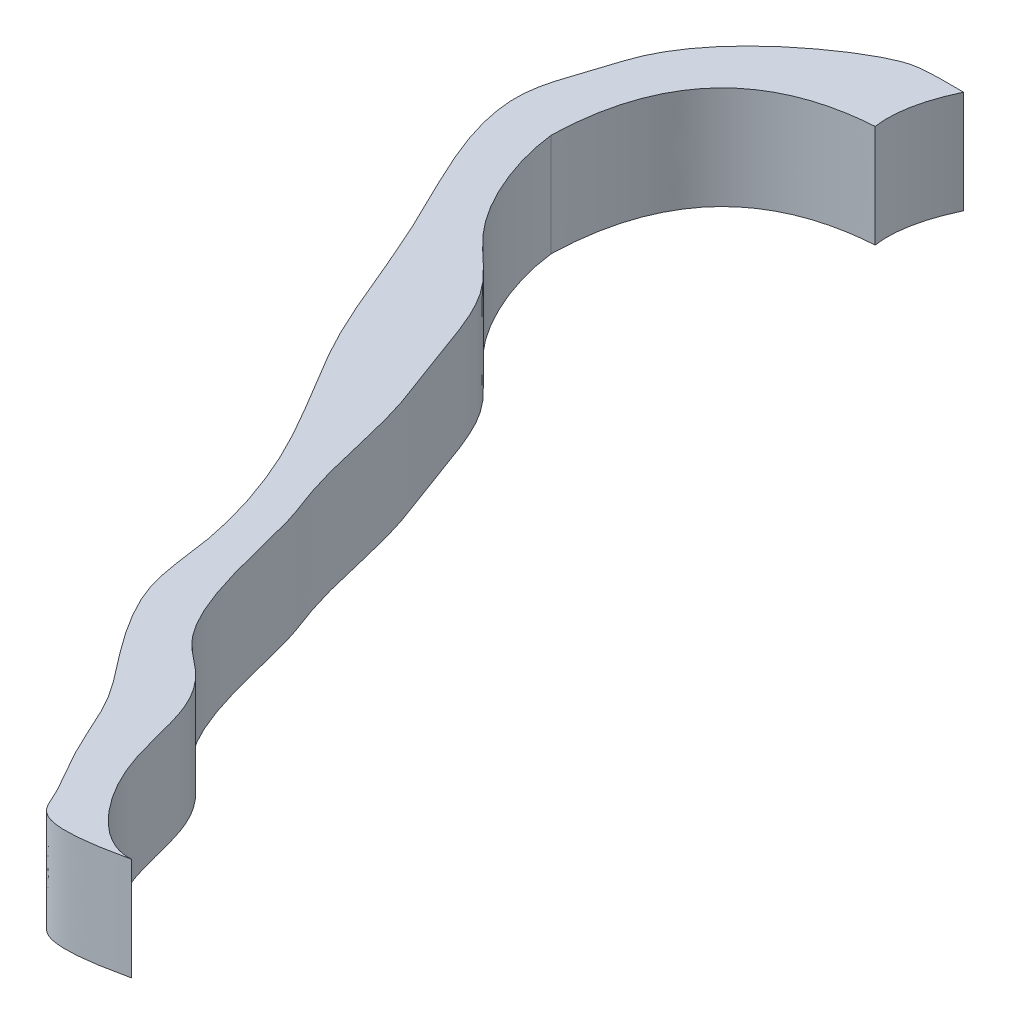
ISO-10303-21;
HEADER;
FILE_DESCRIPTION(('STEP AP214'),'2;1');
FILE_NAME('part.step','',(''),(''),'','','');
FILE_SCHEMA(('AUTOMOTIVE_DESIGN { 1 0 10303 214 1 1 1 1 }'));
ENDSEC;
DATA;
#1=APPLICATION_CONTEXT('core data for automotive mechanical design processes');
#2=APPLICATION_PROTOCOL_DEFINITION('international standard','automotive_design',2000,#1);
#3=PRODUCT_CONTEXT('',#1,'mechanical');
#4=PRODUCT('Part','Part','',(#3));
#5=PRODUCT_RELATED_PRODUCT_CATEGORY('part','',(#4));
#6=PRODUCT_DEFINITION_FORMATION('','',#4);
#7=PRODUCT_DEFINITION_CONTEXT('part definition',#1,'design');
#8=PRODUCT_DEFINITION('design','',#6,#7);
#9=PRODUCT_DEFINITION_SHAPE('','',#8);
#10=(LENGTH_UNIT() NAMED_UNIT(*) SI_UNIT(.MILLI.,.METRE.));
#11=(NAMED_UNIT(*) PLANE_ANGLE_UNIT() SI_UNIT($,.RADIAN.));
#12=(NAMED_UNIT(*) SI_UNIT($,.STERADIAN.) SOLID_ANGLE_UNIT());
#13=UNCERTAINTY_MEASURE_WITH_UNIT(LENGTH_MEASURE(1.E-05),#10,'distance_accuracy_value','');
#14=(GEOMETRIC_REPRESENTATION_CONTEXT(3) GLOBAL_UNCERTAINTY_ASSIGNED_CONTEXT((#13)) GLOBAL_UNIT_ASSIGNED_CONTEXT((#10,
#11,#12)) REPRESENTATION_CONTEXT('',''));
#15=CARTESIAN_POINT('',(0.,0.,0.));
#16=DIRECTION('',(0.,0.,1.));
#17=DIRECTION('',(1.,0.,0.));
#18=AXIS2_PLACEMENT_3D('',#15,#16,#17);
#19=CARTESIAN_POINT('',(24.0375140392618,15.,-145.517039337161));
#20=CARTESIAN_POINT('',(24.2621933412284,15.,-143.639002282934));
#21=CARTESIAN_POINT('',(25.4171269550409,15.,-138.134761259731));
#22=CARTESIAN_POINT('',(30.007706348826,15.,-128.35761833204));
#23=CARTESIAN_POINT('',(39.7991492205917,15.,-121.115164183697));
#24=CARTESIAN_POINT('',(43.2128797081711,15.,-110.146291015422));
#25=CARTESIAN_POINT('',(48.6550116352046,15.,-97.0573730260903));
#26=CARTESIAN_POINT('',(49.9672872180633,15.,-86.7279437435889));
#27=CARTESIAN_POINT('',(54.645986214799,15.,-75.4111400507352));
#28=CARTESIAN_POINT('',(57.5935042038401,15.,-57.5488206758712));
#29=CARTESIAN_POINT('',(72.3520359826397,15.,-47.8515999679621));
#30=CARTESIAN_POINT('',(69.1403617110827,15.,-35.8249751369739));
#31=CARTESIAN_POINT('',(82.723997719919,15.,-21.3135393408815));
#32=CARTESIAN_POINT('',(91.4610009765337,15.,-26.0845568898553));
#33=CARTESIAN_POINT('',(99.3599729309819,15.,-34.1459829190389));
#34=CARTESIAN_POINT('',(106.459091673804,15.,-48.0552498706429));
#35=CARTESIAN_POINT('',(101.533602131844,15.,-62.2604950775486));
#36=CARTESIAN_POINT('',(98.8404018994915,15.,-74.4775870626433));
#37=CARTESIAN_POINT('',(96.868182285158,15.,-87.5543523438553));
#38=CARTESIAN_POINT('',(101.802241124934,15.,-102.14324591199));
#39=CARTESIAN_POINT('',(102.790355638582,15.,-119.297508142269));
#40=CARTESIAN_POINT('',(104.336005258598,15.,-130.446896525846));
#41=CARTESIAN_POINT('',(105.753591562007,15.,-137.401839946369));
#42=CARTESIAN_POINT('',(105.757273732984,15.,-137.419894275042));
#43=B_SPLINE_CURVE_WITH_KNOTS('',3,(#19,#20,#21,#22,#23,#24,#25,#26,#27,#28,#29,#30,#31,#32,#33,
#34,#35,#36,#37,#38,#39,#40,#41,#42),.UNSPECIFIED.,.F.,.F.,(4,1,1,1,1,1,1,1,1,1,1,1,1,1,1,1,1,1,
1,1,1,4),(0.0848827910846383,0.107769947600504,0.154078141193935,0.187829052452645,
0.232552432956342,0.26970929217058,0.335228905495779,0.34759696703288,0.388301803040621,
0.400297277197863,0.462463604104336,0.490432200988639,0.503110695907215,0.523547211958244,
0.568461378057781,0.596541231678332,0.621395322375599,0.653634391335673,0.683152646319912,
0.723780599049945,0.766209008009937,0.766319387221955),.UNSPECIFIED.);
#44=DIRECTION('',(0.,-1.,0.));
#45=VECTOR('',#44,1.);
#46=SURFACE_OF_LINEAR_EXTRUSION('',#43,#45);
#47=CARTESIAN_POINT('',(24.0375140392618,0.,-145.517039337161));
#48=CARTESIAN_POINT('',(24.2621933412284,0.,-143.639002282934));
#49=CARTESIAN_POINT('',(25.4171269550409,0.,-138.134761259731));
#50=CARTESIAN_POINT('',(30.007706348826,0.,-128.35761833204));
#51=CARTESIAN_POINT('',(39.7991492205917,0.,-121.115164183697));
#52=CARTESIAN_POINT('',(43.2128797081711,0.,-110.146291015422));
#53=CARTESIAN_POINT('',(48.6550116352046,0.,-97.0573730260903));
#54=CARTESIAN_POINT('',(49.9672872180633,0.,-86.7279437435889));
#55=CARTESIAN_POINT('',(54.645986214799,0.,-75.4111400507352));
#56=CARTESIAN_POINT('',(57.5935042038401,0.,-57.5488206758712));
#57=CARTESIAN_POINT('',(72.3520359826397,0.,-47.8515999679621));
#58=CARTESIAN_POINT('',(69.1403617110827,0.,-35.8249751369739));
#59=CARTESIAN_POINT('',(82.723997719919,0.,-21.3135393408815));
#60=CARTESIAN_POINT('',(91.4610009765337,0.,-26.0845568898553));
#61=CARTESIAN_POINT('',(99.3599729309819,0.,-34.1459829190389));
#62=CARTESIAN_POINT('',(106.459091673804,0.,-48.0552498706429));
#63=CARTESIAN_POINT('',(101.533602131844,0.,-62.2604950775486));
#64=CARTESIAN_POINT('',(98.8404018994915,0.,-74.4775870626433));
#65=CARTESIAN_POINT('',(96.868182285158,0.,-87.5543523438553));
#66=CARTESIAN_POINT('',(101.802241124934,0.,-102.14324591199));
#67=CARTESIAN_POINT('',(102.790355638582,0.,-119.297508142269));
#68=CARTESIAN_POINT('',(104.336005258598,0.,-130.446896525846));
#69=CARTESIAN_POINT('',(105.753591562007,0.,-137.401839946369));
#70=CARTESIAN_POINT('',(105.757273732984,0.,-137.419894275042));
#71=B_SPLINE_CURVE_WITH_KNOTS('',3,(#47,#48,#49,#50,#51,#52,#53,#54,#55,#56,#57,#58,#59,#60,#61,
#62,#63,#64,#65,#66,#67,#68,#69,#70),.UNSPECIFIED.,.F.,.F.,(4,1,1,1,1,1,1,1,1,1,1,1,1,1,1,1,1,1,
1,1,1,4),(0.0848827910846383,0.107769947600504,0.154078141193935,0.187829052452645,
0.232552432956342,0.26970929217058,0.335228905495779,0.34759696703288,0.388301803040621,
0.400297277197863,0.462463604104336,0.490432200988639,0.503110695907215,0.523547211958244,
0.568461378057781,0.596541231678332,0.621395322375599,0.653634391335673,0.683152646319912,
0.723780599049945,0.766209008009937,0.766319387221955),.UNSPECIFIED.);
#72=CARTESIAN_POINT('',(24.0375140392618,0.,-145.517039337161));
#73=VERTEX_POINT('',#72);
#74=CARTESIAN_POINT('',(84.954156508845,0.,-23.3748451477507));
#75=VERTEX_POINT('',#74);
#76=EDGE_CURVE('E120',#73,#75,#71,.T.);
#77=ORIENTED_EDGE('',*,*,#76,.F.);
#78=DIRECTION('',(0.,-1.,0.));
#79=VECTOR('',#78,1.);
#80=CARTESIAN_POINT('',(24.0375140392618,15.,-145.517039337161));
#81=LINE('',#80,#79);
#82=CARTESIAN_POINT('',(24.0375140392618,15.,-145.517039337161));
#83=VERTEX_POINT('',#82);
#84=EDGE_CURVE('E11',#83,#73,#81,.T.);
#85=ORIENTED_EDGE('',*,*,#84,.F.);
#86=CARTESIAN_POINT('',(84.954156508845,15.,-23.3748451477507));
#87=VERTEX_POINT('',#86);
#88=EDGE_CURVE('E83',#83,#87,#43,.T.);
#89=ORIENTED_EDGE('',*,*,#88,.T.);
#90=DIRECTION('',(0.,-1.,0.));
#91=VECTOR('',#90,1.);
#92=CARTESIAN_POINT('',(84.954156508845,15.,-23.3748451477507));
#93=LINE('',#92,#91);
#94=EDGE_CURVE('E51',#87,#75,#93,.T.);
#95=ORIENTED_EDGE('',*,*,#94,.T.);
#96=EDGE_LOOP('',(#77,#85,#89,#95));
#97=FACE_BOUND('',#96,.T.);
#98=ADVANCED_FACE('F34',(#97),#46,.T.);
#99=CARTESIAN_POINT('',(24.0375140392618,15.,-145.517039337161));
#100=CARTESIAN_POINT('',(24.6153556033182,15.,-168.822282886003));
#101=CARTESIAN_POINT('',(46.5719716464019,15.,-170.254393186871));
#102=B_SPLINE_CURVE_WITH_KNOTS('',2,(#99,#100,#101),.UNSPECIFIED.,.F.,.F.,(3,3),(0.,1.),.UNSPECIFIED.);
#103=DIRECTION('',(0.,-1.,0.));
#104=VECTOR('',#103,1.);
#105=SURFACE_OF_LINEAR_EXTRUSION('',#102,#104);
#106=CARTESIAN_POINT('',(24.0375140392618,0.,-145.517039337161));
#107=CARTESIAN_POINT('',(24.6153556033182,0.,-168.822282886003));
#108=CARTESIAN_POINT('',(46.5719716464019,0.,-170.254393186871));
#109=B_SPLINE_CURVE_WITH_KNOTS('',2,(#106,#107,#108),.UNSPECIFIED.,.F.,.F.,(3,3),(0.,1.),.UNSPECIFIED.);
#110=CARTESIAN_POINT('',(46.5719716464019,0.,-170.254393186871));
#111=VERTEX_POINT('',#110);
#112=EDGE_CURVE('E89',#73,#111,#109,.T.);
#113=ORIENTED_EDGE('',*,*,#112,.T.);
#114=DIRECTION('',(0.,-1.,0.));
#115=VECTOR('',#114,1.);
#116=CARTESIAN_POINT('',(46.5719716464019,15.,-170.254393186871));
#117=LINE('',#116,#115);
#118=CARTESIAN_POINT('',(46.5719716464019,15.,-170.254393186871));
#119=VERTEX_POINT('',#118);
#120=EDGE_CURVE('E43',#119,#111,#117,.T.);
#121=ORIENTED_EDGE('',*,*,#120,.F.);
#122=EDGE_CURVE('E77',#83,#119,#102,.T.);
#123=ORIENTED_EDGE('',*,*,#122,.F.);
#124=ORIENTED_EDGE('',*,*,#84,.T.);
#125=EDGE_LOOP('',(#113,#121,#123,#124));
#126=FACE_BOUND('',#125,.T.);
#127=ADVANCED_FACE('F87',(#126),#105,.F.);
#128=CARTESIAN_POINT('',(105.757273732984,15.,-137.419894275042));
#129=CARTESIAN_POINT('',(99.2151871223601,15.,-145.561651869948));
#130=CARTESIAN_POINT('',(84.8033809971508,15.,-152.603461995185));
#131=CARTESIAN_POINT('',(58.8817948778532,15.,-155.846604376983));
#132=CARTESIAN_POINT('',(41.1998197607615,15.,-165.100807986183));
#133=CARTESIAN_POINT('',(48.685902450927,15.,-181.03033137615));
#134=B_SPLINE_CURVE_WITH_KNOTS('',3,(#128,#129,#130,#131,#132,#133),.UNSPECIFIED.,.F.,.F.,(4,1,
1,4),(0.,0.386611314169124,0.562827951917483,1.),.UNSPECIFIED.);
#135=DIRECTION('',(0.,-1.,0.));
#136=VECTOR('',#135,1.);
#137=SURFACE_OF_LINEAR_EXTRUSION('',#134,#136);
#138=CARTESIAN_POINT('',(105.757273732984,0.,-137.419894275042));
#139=CARTESIAN_POINT('',(99.2151871223601,0.,-145.561651869948));
#140=CARTESIAN_POINT('',(84.8033809971508,0.,-152.603461995185));
#141=CARTESIAN_POINT('',(58.8817948778532,0.,-155.846604376983));
#142=CARTESIAN_POINT('',(41.1998197607615,0.,-165.100807986183));
#143=CARTESIAN_POINT('',(48.685902450927,0.,-181.03033137615));
#144=B_SPLINE_CURVE_WITH_KNOTS('',3,(#138,#139,#140,#141,#142,#143),.UNSPECIFIED.,.F.,.F.,(4,1,
1,4),(0.,0.386611314169124,0.562827951917483,1.),.UNSPECIFIED.);
#145=CARTESIAN_POINT('',(48.685902450927,0.,-181.03033137615));
#146=VERTEX_POINT('',#145);
#147=EDGE_CURVE('E123',#111,#146,#144,.T.);
#148=ORIENTED_EDGE('',*,*,#147,.T.);
#149=DIRECTION('',(0.,-1.,0.));
#150=VECTOR('',#149,1.);
#151=CARTESIAN_POINT('',(48.685902450927,15.,-181.03033137615));
#152=LINE('',#151,#150);
#153=CARTESIAN_POINT('',(48.685902450927,15.,-181.03033137615));
#154=VERTEX_POINT('',#153);
#155=EDGE_CURVE('E65',#154,#146,#152,.T.);
#156=ORIENTED_EDGE('',*,*,#155,.F.);
#157=EDGE_CURVE('E82',#119,#154,#134,.T.);
#158=ORIENTED_EDGE('',*,*,#157,.F.);
#159=ORIENTED_EDGE('',*,*,#120,.T.);
#160=EDGE_LOOP('',(#148,#156,#158,#159));
#161=FACE_BOUND('',#160,.T.);
#162=ADVANCED_FACE('F92',(#161),#137,.F.);
#163=CARTESIAN_POINT('',(84.954156508845,15.,-23.3748451477507));
#164=CARTESIAN_POINT('',(72.9575312090157,15.,-20.6745073594103));
#165=CARTESIAN_POINT('',(71.9674202735228,15.,-25.3606149798888));
#166=CARTESIAN_POINT('',(66.9703108614464,15.,-32.7263567586429));
#167=CARTESIAN_POINT('',(63.4632792782969,15.,-41.939494185241));
#168=CARTESIAN_POINT('',(58.2122190627457,15.,-48.0409081798342));
#169=CARTESIAN_POINT('',(50.9967727001773,15.,-58.5561057735674));
#170=CARTESIAN_POINT('',(50.5560322501531,15.,-70.2906119270367));
#171=CARTESIAN_POINT('',(44.9008971289939,15.,-87.4174539363503));
#172=CARTESIAN_POINT('',(33.109231862165,15.,-103.911358312912));
#173=CARTESIAN_POINT('',(26.397601002108,15.,-123.949892357285));
#174=CARTESIAN_POINT('',(14.0657101576067,15.,-144.879655619492));
#175=CARTESIAN_POINT('',(18.69225357753,15.,-155.824640568956));
#176=CARTESIAN_POINT('',(22.3599245233623,15.,-168.973403316368));
#177=CARTESIAN_POINT('',(39.2401485314358,15.,-181.236738913043));
#178=CARTESIAN_POINT('',(43.1213464452105,15.,-181.068143657368));
#179=CARTESIAN_POINT('',(48.685902450927,15.,-181.03033137615));
#180=B_SPLINE_CURVE_WITH_KNOTS('',3,(#163,#164,#165,#166,#167,#168,#169,#170,#171,#172,#173,
#174,#175,#176,#177,#178,#179),.UNSPECIFIED.,.F.,.F.,(4,1,1,1,1,1,1,1,1,1,1,1,1,1,4),(0.,
0.0444801008782409,0.0900125815812902,0.138443027304737,0.188153336967191,0.244035910987233,
0.300208939869391,0.390948179847946,0.496437396111098,0.61372209800241,0.738952285364165,
0.786997961464123,0.806175267413659,0.93072534485953,1.),.UNSPECIFIED.);
#181=DIRECTION('',(0.,-1.,0.));
#182=VECTOR('',#181,1.);
#183=SURFACE_OF_LINEAR_EXTRUSION('',#180,#182);
#184=CARTESIAN_POINT('',(84.954156508845,0.,-23.3748451477507));
#185=CARTESIAN_POINT('',(72.9575312090157,0.,-20.6745073594103));
#186=CARTESIAN_POINT('',(71.9674202735228,0.,-25.3606149798888));
#187=CARTESIAN_POINT('',(66.9703108614464,0.,-32.7263567586429));
#188=CARTESIAN_POINT('',(63.4632792782969,0.,-41.939494185241));
#189=CARTESIAN_POINT('',(58.2122190627457,0.,-48.0409081798342));
#190=CARTESIAN_POINT('',(50.9967727001773,0.,-58.5561057735674));
#191=CARTESIAN_POINT('',(50.5560322501531,0.,-70.2906119270367));
#192=CARTESIAN_POINT('',(44.9008971289939,0.,-87.4174539363503));
#193=CARTESIAN_POINT('',(33.109231862165,0.,-103.911358312912));
#194=CARTESIAN_POINT('',(26.397601002108,0.,-123.949892357285));
#195=CARTESIAN_POINT('',(14.0657101576067,0.,-144.879655619492));
#196=CARTESIAN_POINT('',(18.69225357753,0.,-155.824640568956));
#197=CARTESIAN_POINT('',(22.3599245233623,0.,-168.973403316368));
#198=CARTESIAN_POINT('',(39.2401485314358,0.,-181.236738913043));
#199=CARTESIAN_POINT('',(43.1213464452105,0.,-181.068143657368));
#200=CARTESIAN_POINT('',(48.685902450927,0.,-181.03033137615));
#201=B_SPLINE_CURVE_WITH_KNOTS('',3,(#184,#185,#186,#187,#188,#189,#190,#191,#192,#193,#194,
#195,#196,#197,#198,#199,#200),.UNSPECIFIED.,.F.,.F.,(4,1,1,1,1,1,1,1,1,1,1,1,1,1,4),(0.,
0.0444801008782409,0.0900125815812902,0.138443027304737,0.188153336967191,0.244035910987233,
0.300208939869391,0.390948179847946,0.496437396111098,0.61372209800241,0.738952285364165,
0.786997961464123,0.806175267413659,0.93072534485953,1.),.UNSPECIFIED.);
#202=EDGE_CURVE('E139',#75,#146,#201,.T.);
#203=ORIENTED_EDGE('',*,*,#202,.F.);
#204=ORIENTED_EDGE('',*,*,#94,.F.);
#205=EDGE_CURVE('E93',#87,#154,#180,.T.);
#206=ORIENTED_EDGE('',*,*,#205,.T.);
#207=ORIENTED_EDGE('',*,*,#155,.T.);
#208=EDGE_LOOP('',(#203,#204,#206,#207));
#209=FACE_BOUND('',#208,.T.);
#210=ADVANCED_FACE('F112',(#209),#183,.T.);
#211=CARTESIAN_POINT('',(0.,15.,0.));
#212=DIRECTION('',(0.,1.,0.));
#213=DIRECTION('',(0.,0.,1.));
#214=AXIS2_PLACEMENT_3D('',#211,#212,#213);
#215=PLANE('',#214);
#216=ORIENTED_EDGE('',*,*,#88,.F.);
#217=ORIENTED_EDGE('',*,*,#122,.T.);
#218=ORIENTED_EDGE('',*,*,#157,.T.);
#219=ORIENTED_EDGE('',*,*,#205,.F.);
#220=EDGE_LOOP('',(#216,#217,#218,#219));
#221=FACE_BOUND('',#220,.T.);
#222=ADVANCED_FACE('F79',(#221),#215,.T.);
#223=CARTESIAN_POINT('',(0.,0.,0.));
#224=DIRECTION('',(0.,1.,0.));
#225=DIRECTION('',(0.,0.,1.));
#226=AXIS2_PLACEMENT_3D('',#223,#224,#225);
#227=PLANE('',#226);
#228=ORIENTED_EDGE('',*,*,#76,.T.);
#229=ORIENTED_EDGE('',*,*,#202,.T.);
#230=ORIENTED_EDGE('',*,*,#147,.F.);
#231=ORIENTED_EDGE('',*,*,#112,.F.);
#232=EDGE_LOOP('',(#228,#229,#230,#231));
#233=FACE_BOUND('',#232,.T.);
#234=ADVANCED_FACE('F160',(#233),#227,.F.);
#235=CLOSED_SHELL('',(#98,#127,#162,#210,#222,#234));
#236=MANIFOLD_SOLID_BREP('B2',#235);
#237=ADVANCED_BREP_SHAPE_REPRESENTATION('',(#18,#236),#14);
#238=SHAPE_DEFINITION_REPRESENTATION(#9,#237);
ENDSEC;
END-ISO-10303-21;
